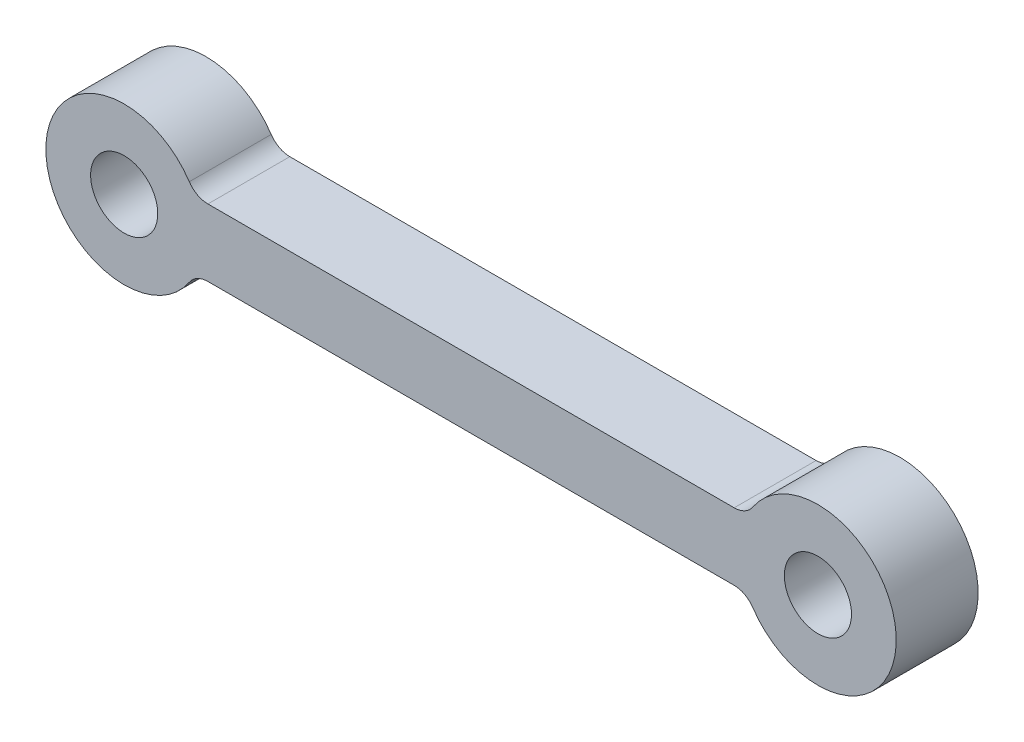
ISO-10303-21;
HEADER;
FILE_DESCRIPTION(('STEP AP214'),'2;1');
FILE_NAME('part.step','',(''),(''),'','','');
FILE_SCHEMA(('AUTOMOTIVE_DESIGN { 1 0 10303 214 1 1 1 1 }'));
ENDSEC;
DATA;
#1=APPLICATION_CONTEXT('core data for automotive mechanical design processes');
#2=APPLICATION_PROTOCOL_DEFINITION('international standard','automotive_design',2000,#1);
#3=PRODUCT_CONTEXT('',#1,'mechanical');
#4=PRODUCT('Part','Part','',(#3));
#5=PRODUCT_RELATED_PRODUCT_CATEGORY('part','',(#4));
#6=PRODUCT_DEFINITION_FORMATION('','',#4);
#7=PRODUCT_DEFINITION_CONTEXT('part definition',#1,'design');
#8=PRODUCT_DEFINITION('design','',#6,#7);
#9=PRODUCT_DEFINITION_SHAPE('','',#8);
#10=(LENGTH_UNIT() NAMED_UNIT(*) SI_UNIT(.MILLI.,.METRE.));
#11=(NAMED_UNIT(*) PLANE_ANGLE_UNIT() SI_UNIT($,.RADIAN.));
#12=(NAMED_UNIT(*) SI_UNIT($,.STERADIAN.) SOLID_ANGLE_UNIT());
#13=UNCERTAINTY_MEASURE_WITH_UNIT(LENGTH_MEASURE(1.E-05),#10,'distance_accuracy_value','');
#14=(GEOMETRIC_REPRESENTATION_CONTEXT(3) GLOBAL_UNCERTAINTY_ASSIGNED_CONTEXT((#13)) GLOBAL_UNIT_ASSIGNED_CONTEXT((#10,
#11,#12)) REPRESENTATION_CONTEXT('',''));
#15=CARTESIAN_POINT('',(0.,0.,0.));
#16=DIRECTION('',(0.,0.,1.));
#17=DIRECTION('',(1.,0.,0.));
#18=AXIS2_PLACEMENT_3D('',#15,#16,#17);
#19=CARTESIAN_POINT('',(-15.5,0.,1.83));
#20=DIRECTION('',(0.,0.,-1.));
#21=DIRECTION('',(-1.,0.,0.));
#22=AXIS2_PLACEMENT_3D('',#19,#20,#21);
#23=CYLINDRICAL_SURFACE('',#22,3.5);
#24=CARTESIAN_POINT('',(-15.5,0.,-1.83));
#25=DIRECTION('',(0.,0.,1.));
#26=DIRECTION('',(1.,0.,0.));
#27=AXIS2_PLACEMENT_3D('',#24,#25,#26);
#28=CIRCLE('',#27,3.5);
#29=CARTESIAN_POINT('',(-12.5898220325092,1.94444444444444,-1.83));
#30=VERTEX_POINT('',#29);
#31=CARTESIAN_POINT('',(-12.5898220325092,-1.94444444444444,-1.83));
#32=VERTEX_POINT('',#31);
#33=EDGE_CURVE('E140',#30,#32,#28,.T.);
#34=ORIENTED_EDGE('',*,*,#33,.T.);
#35=DIRECTION('',(0.,0.,-1.));
#36=VECTOR('',#35,1.);
#37=CARTESIAN_POINT('',(-12.5898220325092,-1.94444444444444,1.83));
#38=LINE('',#37,#36);
#39=CARTESIAN_POINT('',(-12.5898220325092,-1.94444444444444,1.83));
#40=VERTEX_POINT('',#39);
#41=EDGE_CURVE('E155',#32,#40,#38,.F.);
#42=ORIENTED_EDGE('',*,*,#41,.T.);
#43=CARTESIAN_POINT('',(-15.5,0.,1.83));
#44=DIRECTION('',(0.,0.,1.));
#45=DIRECTION('',(1.,0.,0.));
#46=AXIS2_PLACEMENT_3D('',#43,#44,#45);
#47=CIRCLE('',#46,3.5);
#48=CARTESIAN_POINT('',(-12.5898220325092,1.94444444444444,1.83));
#49=VERTEX_POINT('',#48);
#50=EDGE_CURVE('E176',#49,#40,#47,.T.);
#51=ORIENTED_EDGE('',*,*,#50,.F.);
#52=DIRECTION('',(0.,0.,-1.));
#53=VECTOR('',#52,1.);
#54=CARTESIAN_POINT('',(-12.5898220325092,1.94444444444444,1.83));
#55=LINE('',#54,#53);
#56=EDGE_CURVE('E152',#49,#30,#55,.T.);
#57=ORIENTED_EDGE('',*,*,#56,.T.);
#58=EDGE_LOOP('',(#34,#42,#51,#57));
#59=FACE_BOUND('',#58,.T.);
#60=ADVANCED_FACE('F41',(#59),#23,.T.);
#61=CARTESIAN_POINT('',(0.,-1.5,1.83));
#62=DIRECTION('',(0.,1.,0.));
#63=DIRECTION('',(0.,0.,1.));
#64=AXIS2_PLACEMENT_3D('',#61,#62,#63);
#65=PLANE('',#64);
#66=DIRECTION('',(1.,0.,0.));
#67=VECTOR('',#66,1.);
#68=CARTESIAN_POINT('',(0.,-1.5,-1.83));
#69=LINE('',#68,#67);
#70=CARTESIAN_POINT('',(-11.7583426132261,-1.5,-1.83));
#71=VERTEX_POINT('',#70);
#72=CARTESIAN_POINT('',(11.7583426132261,-1.5,-1.83));
#73=VERTEX_POINT('',#72);
#74=EDGE_CURVE('E136',#71,#73,#69,.T.);
#75=ORIENTED_EDGE('',*,*,#74,.T.);
#76=DIRECTION('',(0.,0.,1.));
#77=VECTOR('',#76,1.);
#78=CARTESIAN_POINT('',(11.7583426132261,-1.5,1.83));
#79=LINE('',#78,#77);
#80=CARTESIAN_POINT('',(11.7583426132261,-1.5,1.83));
#81=VERTEX_POINT('',#80);
#82=EDGE_CURVE('E112',#73,#81,#79,.T.);
#83=ORIENTED_EDGE('',*,*,#82,.T.);
#84=DIRECTION('',(1.,0.,0.));
#85=VECTOR('',#84,1.);
#86=CARTESIAN_POINT('',(0.,-1.5,1.83));
#87=LINE('',#86,#85);
#88=CARTESIAN_POINT('',(-11.7583426132261,-1.5,1.83));
#89=VERTEX_POINT('',#88);
#90=EDGE_CURVE('E181',#89,#81,#87,.T.);
#91=ORIENTED_EDGE('',*,*,#90,.F.);
#92=DIRECTION('',(0.,0.,1.));
#93=VECTOR('',#92,1.);
#94=CARTESIAN_POINT('',(-11.7583426132261,-1.5,-1.83));
#95=LINE('',#94,#93);
#96=EDGE_CURVE('E127',#89,#71,#95,.F.);
#97=ORIENTED_EDGE('',*,*,#96,.T.);
#98=EDGE_LOOP('',(#75,#83,#91,#97));
#99=FACE_BOUND('',#98,.T.);
#100=ADVANCED_FACE('F199',(#99),#65,.F.);
#101=CARTESIAN_POINT('',(15.5,0.,1.83));
#102=DIRECTION('',(0.,0.,-1.));
#103=DIRECTION('',(-1.,0.,0.));
#104=AXIS2_PLACEMENT_3D('',#101,#102,#103);
#105=CYLINDRICAL_SURFACE('',#104,3.5);
#106=CARTESIAN_POINT('',(15.5,0.,1.83));
#107=DIRECTION('',(0.,0.,1.));
#108=DIRECTION('',(1.,0.,0.));
#109=AXIS2_PLACEMENT_3D('',#106,#107,#108);
#110=CIRCLE('',#109,3.5);
#111=CARTESIAN_POINT('',(12.5898220325092,-1.94444444444444,1.83));
#112=VERTEX_POINT('',#111);
#113=CARTESIAN_POINT('',(12.5898220325092,1.94444444444445,1.83));
#114=VERTEX_POINT('',#113);
#115=EDGE_CURVE('E126',#112,#114,#110,.T.);
#116=ORIENTED_EDGE('',*,*,#115,.F.);
#117=DIRECTION('',(0.,0.,-1.));
#118=VECTOR('',#117,1.);
#119=CARTESIAN_POINT('',(12.5898220325092,-1.94444444444444,1.83));
#120=LINE('',#119,#118);
#121=CARTESIAN_POINT('',(12.5898220325092,-1.94444444444444,-1.83));
#122=VERTEX_POINT('',#121);
#123=EDGE_CURVE('E111',#112,#122,#120,.T.);
#124=ORIENTED_EDGE('',*,*,#123,.T.);
#125=CARTESIAN_POINT('',(15.5,0.,-1.83));
#126=DIRECTION('',(0.,0.,1.));
#127=DIRECTION('',(1.,0.,0.));
#128=AXIS2_PLACEMENT_3D('',#125,#126,#127);
#129=CIRCLE('',#128,3.5);
#130=CARTESIAN_POINT('',(12.5898220325092,1.94444444444445,-1.83));
#131=VERTEX_POINT('',#130);
#132=EDGE_CURVE('E124',#122,#131,#129,.T.);
#133=ORIENTED_EDGE('',*,*,#132,.T.);
#134=DIRECTION('',(0.,0.,-1.));
#135=VECTOR('',#134,1.);
#136=CARTESIAN_POINT('',(12.5898220325092,1.94444444444445,1.83));
#137=LINE('',#136,#135);
#138=EDGE_CURVE('E128',#131,#114,#137,.F.);
#139=ORIENTED_EDGE('',*,*,#138,.T.);
#140=EDGE_LOOP('',(#116,#124,#133,#139));
#141=FACE_BOUND('',#140,.T.);
#142=ADVANCED_FACE('F123',(#141),#105,.T.);
#143=CARTESIAN_POINT('',(0.,1.5,1.83));
#144=DIRECTION('',(0.,1.,0.));
#145=DIRECTION('',(0.,0.,1.));
#146=AXIS2_PLACEMENT_3D('',#143,#144,#145);
#147=PLANE('',#146);
#148=DIRECTION('',(1.,0.,0.));
#149=VECTOR('',#148,1.);
#150=CARTESIAN_POINT('',(0.,1.5,1.83));
#151=LINE('',#150,#149);
#152=CARTESIAN_POINT('',(-11.7583426132261,1.5,1.83));
#153=VERTEX_POINT('',#152);
#154=CARTESIAN_POINT('',(11.7583426132261,1.5,1.83));
#155=VERTEX_POINT('',#154);
#156=EDGE_CURVE('E178',#153,#155,#151,.T.);
#157=ORIENTED_EDGE('',*,*,#156,.T.);
#158=DIRECTION('',(0.,0.,-1.));
#159=VECTOR('',#158,1.);
#160=CARTESIAN_POINT('',(11.7583426132261,1.5,1.83));
#161=LINE('',#160,#159);
#162=CARTESIAN_POINT('',(11.7583426132261,1.5,-1.83));
#163=VERTEX_POINT('',#162);
#164=EDGE_CURVE('E118',#155,#163,#161,.T.);
#165=ORIENTED_EDGE('',*,*,#164,.T.);
#166=DIRECTION('',(1.,0.,0.));
#167=VECTOR('',#166,1.);
#168=CARTESIAN_POINT('',(0.,1.5,-1.83));
#169=LINE('',#168,#167);
#170=CARTESIAN_POINT('',(-11.7583426132261,1.5,-1.83));
#171=VERTEX_POINT('',#170);
#172=EDGE_CURVE('E135',#171,#163,#169,.T.);
#173=ORIENTED_EDGE('',*,*,#172,.F.);
#174=DIRECTION('',(0.,0.,-1.));
#175=VECTOR('',#174,1.);
#176=CARTESIAN_POINT('',(-11.7583426132261,1.5,1.83));
#177=LINE('',#176,#175);
#178=EDGE_CURVE('E63',#171,#153,#177,.F.);
#179=ORIENTED_EDGE('',*,*,#178,.T.);
#180=EDGE_LOOP('',(#157,#165,#173,#179));
#181=FACE_BOUND('',#180,.T.);
#182=ADVANCED_FACE('F169',(#181),#147,.T.);
#183=CARTESIAN_POINT('',(-15.5,0.,1.83));
#184=DIRECTION('',(0.,0.,-1.));
#185=DIRECTION('',(-1.,0.,0.));
#186=AXIS2_PLACEMENT_3D('',#183,#184,#185);
#187=CYLINDRICAL_SURFACE('',#186,1.5);
#188=CARTESIAN_POINT('',(-15.5,0.,1.83));
#189=DIRECTION('',(0.,0.,1.));
#190=DIRECTION('',(1.,0.,0.));
#191=AXIS2_PLACEMENT_3D('',#188,#189,#190);
#192=CIRCLE('',#191,1.5);
#193=CARTESIAN_POINT('',(-14.,0.,1.83));
#194=VERTEX_POINT('',#193);
#195=EDGE_CURVE('E146',#194,#194,#192,.T.);
#196=ORIENTED_EDGE('',*,*,#195,.T.);
#197=EDGE_LOOP('',(#196));
#198=FACE_BOUND('',#197,.T.);
#199=CARTESIAN_POINT('',(-15.5,0.,-1.83));
#200=DIRECTION('',(0.,0.,1.));
#201=DIRECTION('',(1.,0.,0.));
#202=AXIS2_PLACEMENT_3D('',#199,#200,#201);
#203=CIRCLE('',#202,1.5);
#204=CARTESIAN_POINT('',(-14.,0.,-1.83));
#205=VERTEX_POINT('',#204);
#206=EDGE_CURVE('E192',#205,#205,#203,.T.);
#207=ORIENTED_EDGE('',*,*,#206,.F.);
#208=EDGE_LOOP('',(#207));
#209=FACE_BOUND('',#208,.T.);
#210=ADVANCED_FACE('F210',(#198,#209),#187,.F.);
#211=CARTESIAN_POINT('',(15.5,0.,1.83));
#212=DIRECTION('',(0.,0.,-1.));
#213=DIRECTION('',(-1.,0.,0.));
#214=AXIS2_PLACEMENT_3D('',#211,#212,#213);
#215=CYLINDRICAL_SURFACE('',#214,1.5);
#216=CARTESIAN_POINT('',(15.5,0.,1.83));
#217=DIRECTION('',(0.,0.,1.));
#218=DIRECTION('',(1.,0.,0.));
#219=AXIS2_PLACEMENT_3D('',#216,#217,#218);
#220=CIRCLE('',#219,1.5);
#221=CARTESIAN_POINT('',(17.,0.,1.83));
#222=VERTEX_POINT('',#221);
#223=EDGE_CURVE('E147',#222,#222,#220,.T.);
#224=ORIENTED_EDGE('',*,*,#223,.T.);
#225=EDGE_LOOP('',(#224));
#226=FACE_BOUND('',#225,.T.);
#227=CARTESIAN_POINT('',(15.5,0.,-1.83));
#228=DIRECTION('',(0.,0.,1.));
#229=DIRECTION('',(1.,0.,0.));
#230=AXIS2_PLACEMENT_3D('',#227,#228,#229);
#231=CIRCLE('',#230,1.5);
#232=CARTESIAN_POINT('',(17.,0.,-1.83));
#233=VERTEX_POINT('',#232);
#234=EDGE_CURVE('E138',#233,#233,#231,.T.);
#235=ORIENTED_EDGE('',*,*,#234,.F.);
#236=EDGE_LOOP('',(#235));
#237=FACE_BOUND('',#236,.T.);
#238=ADVANCED_FACE('F213',(#226,#237),#215,.F.);
#239=CARTESIAN_POINT('',(0.,0.,1.83));
#240=DIRECTION('',(0.,0.,1.));
#241=DIRECTION('',(1.,0.,0.));
#242=AXIS2_PLACEMENT_3D('',#239,#240,#241);
#243=PLANE('',#242);
#244=ORIENTED_EDGE('',*,*,#195,.F.);
#245=EDGE_LOOP('',(#244));
#246=FACE_BOUND('',#245,.T.);
#247=ORIENTED_EDGE('',*,*,#156,.F.);
#248=CARTESIAN_POINT('',(-11.7583426132261,2.5,1.83));
#249=DIRECTION('',(0.,0.,1.));
#250=DIRECTION('',(1.,0.,0.));
#251=AXIS2_PLACEMENT_3D('',#248,#249,#250);
#252=CIRCLE('',#251,1.);
#253=EDGE_CURVE('E11',#153,#49,#252,.F.);
#254=ORIENTED_EDGE('',*,*,#253,.T.);
#255=ORIENTED_EDGE('',*,*,#50,.T.);
#256=CARTESIAN_POINT('',(-11.7583426132261,-2.5,1.83));
#257=DIRECTION('',(0.,0.,1.));
#258=DIRECTION('',(1.,0.,0.));
#259=AXIS2_PLACEMENT_3D('',#256,#257,#258);
#260=CIRCLE('',#259,1.);
#261=EDGE_CURVE('E163',#40,#89,#260,.F.);
#262=ORIENTED_EDGE('',*,*,#261,.T.);
#263=ORIENTED_EDGE('',*,*,#90,.T.);
#264=CARTESIAN_POINT('',(11.7583426132261,-2.5,1.83));
#265=DIRECTION('',(0.,0.,1.));
#266=DIRECTION('',(1.,0.,0.));
#267=AXIS2_PLACEMENT_3D('',#264,#265,#266);
#268=CIRCLE('',#267,1.);
#269=EDGE_CURVE('E117',#81,#112,#268,.F.);
#270=ORIENTED_EDGE('',*,*,#269,.T.);
#271=ORIENTED_EDGE('',*,*,#115,.T.);
#272=CARTESIAN_POINT('',(11.7583426132261,2.5,1.83));
#273=DIRECTION('',(0.,0.,1.));
#274=DIRECTION('',(1.,0.,0.));
#275=AXIS2_PLACEMENT_3D('',#272,#273,#274);
#276=CIRCLE('',#275,1.);
#277=EDGE_CURVE('E56',#114,#155,#276,.F.);
#278=ORIENTED_EDGE('',*,*,#277,.T.);
#279=EDGE_LOOP('',(#247,#254,#255,#262,#263,#270,#271,#278));
#280=FACE_BOUND('',#279,.T.);
#281=ORIENTED_EDGE('',*,*,#223,.F.);
#282=EDGE_LOOP('',(#281));
#283=FACE_BOUND('',#282,.T.);
#284=ADVANCED_FACE('F174',(#246,#280,#283),#243,.T.);
#285=CARTESIAN_POINT('',(0.,0.,-1.83));
#286=DIRECTION('',(0.,0.,1.));
#287=DIRECTION('',(1.,0.,0.));
#288=AXIS2_PLACEMENT_3D('',#285,#286,#287);
#289=PLANE('',#288);
#290=ORIENTED_EDGE('',*,*,#206,.T.);
#291=EDGE_LOOP('',(#290));
#292=FACE_BOUND('',#291,.T.);
#293=ORIENTED_EDGE('',*,*,#33,.F.);
#294=CARTESIAN_POINT('',(-11.7583426132261,2.5,-1.83));
#295=DIRECTION('',(0.,0.,1.));
#296=DIRECTION('',(1.,0.,0.));
#297=AXIS2_PLACEMENT_3D('',#294,#295,#296);
#298=CIRCLE('',#297,1.);
#299=EDGE_CURVE('E49',#30,#171,#298,.T.);
#300=ORIENTED_EDGE('',*,*,#299,.T.);
#301=ORIENTED_EDGE('',*,*,#172,.T.);
#302=CARTESIAN_POINT('',(11.7583426132261,2.5,-1.83));
#303=DIRECTION('',(0.,0.,1.));
#304=DIRECTION('',(1.,0.,0.));
#305=AXIS2_PLACEMENT_3D('',#302,#303,#304);
#306=CIRCLE('',#305,1.);
#307=EDGE_CURVE('E134',#163,#131,#306,.T.);
#308=ORIENTED_EDGE('',*,*,#307,.T.);
#309=ORIENTED_EDGE('',*,*,#132,.F.);
#310=CARTESIAN_POINT('',(11.7583426132261,-2.5,-1.83));
#311=DIRECTION('',(0.,0.,1.));
#312=DIRECTION('',(1.,0.,0.));
#313=AXIS2_PLACEMENT_3D('',#310,#311,#312);
#314=CIRCLE('',#313,1.);
#315=EDGE_CURVE('E107',#122,#73,#314,.T.);
#316=ORIENTED_EDGE('',*,*,#315,.T.);
#317=ORIENTED_EDGE('',*,*,#74,.F.);
#318=CARTESIAN_POINT('',(-11.7583426132261,-2.5,-1.83));
#319=DIRECTION('',(0.,0.,1.));
#320=DIRECTION('',(1.,0.,0.));
#321=AXIS2_PLACEMENT_3D('',#318,#319,#320);
#322=CIRCLE('',#321,1.);
#323=EDGE_CURVE('E161',#71,#32,#322,.T.);
#324=ORIENTED_EDGE('',*,*,#323,.T.);
#325=EDGE_LOOP('',(#293,#300,#301,#308,#309,#316,#317,#324));
#326=FACE_BOUND('',#325,.T.);
#327=ORIENTED_EDGE('',*,*,#234,.T.);
#328=EDGE_LOOP('',(#327));
#329=FACE_BOUND('',#328,.T.);
#330=ADVANCED_FACE('F131',(#292,#326,#329),#289,.F.);
#331=CARTESIAN_POINT('',(11.7583426132261,-2.5,1.83));
#332=DIRECTION('',(0.,0.,-1.));
#333=DIRECTION('',(-1.,0.,0.));
#334=AXIS2_PLACEMENT_3D('',#331,#332,#333);
#335=CYLINDRICAL_SURFACE('',#334,1.);
#336=ORIENTED_EDGE('',*,*,#269,.F.);
#337=ORIENTED_EDGE('',*,*,#82,.F.);
#338=ORIENTED_EDGE('',*,*,#315,.F.);
#339=ORIENTED_EDGE('',*,*,#123,.F.);
#340=EDGE_LOOP('',(#336,#337,#338,#339));
#341=FACE_BOUND('',#340,.T.);
#342=ADVANCED_FACE('F110',(#341),#335,.F.);
#343=CARTESIAN_POINT('',(-11.7583426132261,-2.5,1.83));
#344=DIRECTION('',(0.,0.,-1.));
#345=DIRECTION('',(-1.,0.,0.));
#346=AXIS2_PLACEMENT_3D('',#343,#344,#345);
#347=CYLINDRICAL_SURFACE('',#346,1.);
#348=ORIENTED_EDGE('',*,*,#261,.F.);
#349=ORIENTED_EDGE('',*,*,#41,.F.);
#350=ORIENTED_EDGE('',*,*,#323,.F.);
#351=ORIENTED_EDGE('',*,*,#96,.F.);
#352=EDGE_LOOP('',(#348,#349,#350,#351));
#353=FACE_BOUND('',#352,.T.);
#354=ADVANCED_FACE('F195',(#353),#347,.F.);
#355=CARTESIAN_POINT('',(11.7583426132261,2.5,1.83));
#356=DIRECTION('',(0.,0.,-1.));
#357=DIRECTION('',(-1.,0.,0.));
#358=AXIS2_PLACEMENT_3D('',#355,#356,#357);
#359=CYLINDRICAL_SURFACE('',#358,1.);
#360=ORIENTED_EDGE('',*,*,#277,.F.);
#361=ORIENTED_EDGE('',*,*,#138,.F.);
#362=ORIENTED_EDGE('',*,*,#307,.F.);
#363=ORIENTED_EDGE('',*,*,#164,.F.);
#364=EDGE_LOOP('',(#360,#361,#362,#363));
#365=FACE_BOUND('',#364,.T.);
#366=ADVANCED_FACE('F218',(#365),#359,.F.);
#367=CARTESIAN_POINT('',(-11.7583426132261,2.5,1.83));
#368=DIRECTION('',(0.,0.,-1.));
#369=DIRECTION('',(-1.,0.,0.));
#370=AXIS2_PLACEMENT_3D('',#367,#368,#369);
#371=CYLINDRICAL_SURFACE('',#370,1.);
#372=ORIENTED_EDGE('',*,*,#253,.F.);
#373=ORIENTED_EDGE('',*,*,#178,.F.);
#374=ORIENTED_EDGE('',*,*,#299,.F.);
#375=ORIENTED_EDGE('',*,*,#56,.F.);
#376=EDGE_LOOP('',(#372,#373,#374,#375));
#377=FACE_BOUND('',#376,.T.);
#378=ADVANCED_FACE('F43',(#377),#371,.F.);
#379=CLOSED_SHELL('',(#60,#100,#142,#182,#210,#238,#284,#330,#342,#354,#366,#378));
#380=MANIFOLD_SOLID_BREP('B2',#379);
#381=ADVANCED_BREP_SHAPE_REPRESENTATION('',(#18,#380),#14);
#382=SHAPE_DEFINITION_REPRESENTATION(#9,#381);
ENDSEC;
END-ISO-10303-21;
